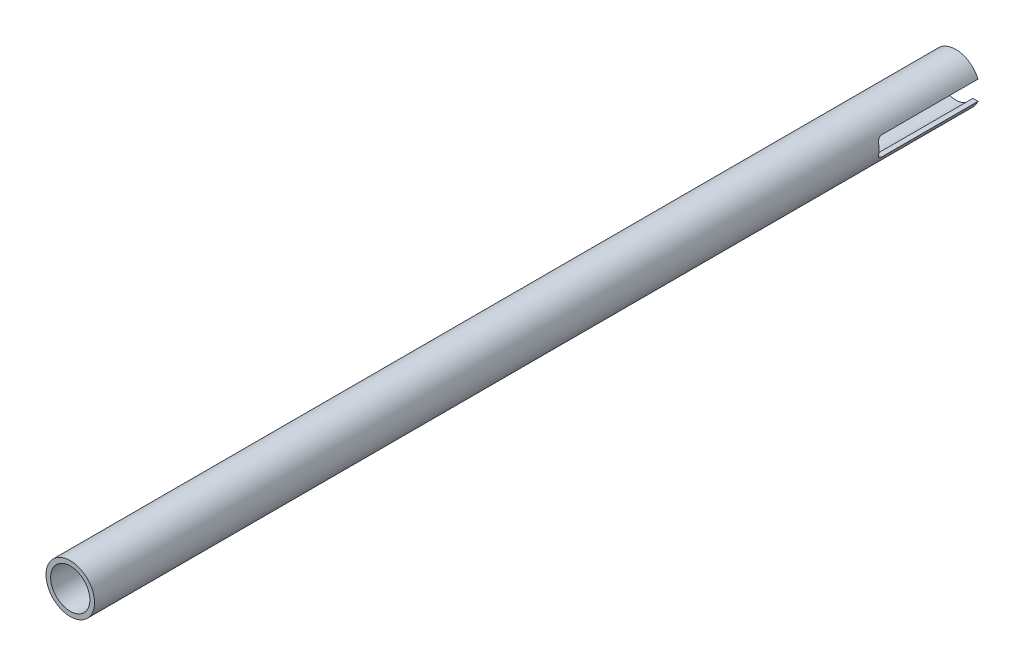
ISO-10303-21;
HEADER;
FILE_DESCRIPTION(('STEP AP214'),'2;1');
FILE_NAME('part.step','',(''),(''),'','','');
FILE_SCHEMA(('AUTOMOTIVE_DESIGN { 1 0 10303 214 1 1 1 1 }'));
ENDSEC;
DATA;
#1=APPLICATION_CONTEXT('core data for automotive mechanical design processes');
#2=APPLICATION_PROTOCOL_DEFINITION('international standard','automotive_design',2000,#1);
#3=PRODUCT_CONTEXT('',#1,'mechanical');
#4=PRODUCT('Part','Part','',(#3));
#5=PRODUCT_RELATED_PRODUCT_CATEGORY('part','',(#4));
#6=PRODUCT_DEFINITION_FORMATION('','',#4);
#7=PRODUCT_DEFINITION_CONTEXT('part definition',#1,'design');
#8=PRODUCT_DEFINITION('design','',#6,#7);
#9=PRODUCT_DEFINITION_SHAPE('','',#8);
#10=(LENGTH_UNIT() NAMED_UNIT(*) SI_UNIT(.MILLI.,.METRE.));
#11=(NAMED_UNIT(*) PLANE_ANGLE_UNIT() SI_UNIT($,.RADIAN.));
#12=(NAMED_UNIT(*) SI_UNIT($,.STERADIAN.) SOLID_ANGLE_UNIT());
#13=UNCERTAINTY_MEASURE_WITH_UNIT(LENGTH_MEASURE(1.E-05),#10,'distance_accuracy_value','');
#14=(GEOMETRIC_REPRESENTATION_CONTEXT(3) GLOBAL_UNCERTAINTY_ASSIGNED_CONTEXT((#13)) GLOBAL_UNIT_ASSIGNED_CONTEXT((#10,
#11,#12)) REPRESENTATION_CONTEXT('',''));
#15=CARTESIAN_POINT('',(0.,0.,0.));
#16=DIRECTION('',(0.,0.,1.));
#17=DIRECTION('',(1.,0.,0.));
#18=AXIS2_PLACEMENT_3D('',#15,#16,#17);
#19=CARTESIAN_POINT('',(0.,0.,0.));
#20=DIRECTION('',(0.,0.,1.));
#21=DIRECTION('',(1.,0.,0.));
#22=AXIS2_PLACEMENT_3D('',#19,#20,#21);
#23=PLANE('',#22);
#24=DIRECTION('',(-1.,0.,0.));
#25=VECTOR('',#24,1.);
#26=CARTESIAN_POINT('',(376.220399741654,-3.17500000000001,0.));
#27=LINE('',#26,#25);
#28=CARTESIAN_POINT('',(7.34407080575888,-3.17500000000001,0.));
#29=VERTEX_POINT('',#28);
#30=CARTESIAN_POINT('',(5.64543213580679,-3.17499999999999,0.));
#31=VERTEX_POINT('',#30);
#32=EDGE_CURVE('E70',#29,#31,#27,.T.);
#33=ORIENTED_EDGE('',*,*,#32,.F.);
#34=CARTESIAN_POINT('',(0.,0.,0.));
#35=DIRECTION('',(0.,0.,1.));
#36=DIRECTION('',(1.,0.,0.));
#37=AXIS2_PLACEMENT_3D('',#34,#35,#36);
#38=CIRCLE('',#37,8.001);
#39=CARTESIAN_POINT('',(-7.34407080575888,-3.17500000000001,0.));
#40=VERTEX_POINT('',#39);
#41=EDGE_CURVE('E161',#40,#29,#38,.T.);
#42=ORIENTED_EDGE('',*,*,#41,.F.);
#43=CARTESIAN_POINT('',(-5.64543213580682,-3.17500000000001,0.));
#44=VERTEX_POINT('',#43);
#45=EDGE_CURVE('E155',#44,#40,#27,.T.);
#46=ORIENTED_EDGE('',*,*,#45,.F.);
#47=CARTESIAN_POINT('',(0.,0.,0.));
#48=DIRECTION('',(0.,0.,1.));
#49=DIRECTION('',(1.,0.,0.));
#50=AXIS2_PLACEMENT_3D('',#47,#48,#49);
#51=CIRCLE('',#50,6.477);
#52=EDGE_CURVE('E266',#44,#31,#51,.T.);
#53=ORIENTED_EDGE('',*,*,#52,.T.);
#54=EDGE_LOOP('',(#33,#42,#46,#53));
#55=FACE_BOUND('',#54,.T.);
#56=ADVANCED_FACE('F45',(#55),#23,.F.);
#57=CARTESIAN_POINT('',(0.,0.,292.1));
#58=DIRECTION('',(0.,0.,-1.));
#59=DIRECTION('',(-1.,0.,0.));
#60=AXIS2_PLACEMENT_3D('',#57,#58,#59);
#61=CYLINDRICAL_SURFACE('',#60,8.001);
#62=CARTESIAN_POINT('',(0.,0.,292.1));
#63=DIRECTION('',(0.,0.,1.));
#64=DIRECTION('',(1.,0.,0.));
#65=AXIS2_PLACEMENT_3D('',#62,#63,#64);
#66=CIRCLE('',#65,8.001);
#67=CARTESIAN_POINT('',(8.001,0.,292.1));
#68=VERTEX_POINT('',#67);
#69=EDGE_CURVE('E275',#68,#68,#66,.T.);
#70=ORIENTED_EDGE('',*,*,#69,.F.);
#71=EDGE_LOOP('',(#70));
#72=FACE_BOUND('',#71,.T.);
#73=DIRECTION('',(0.,0.,-1.));
#74=VECTOR('',#73,1.);
#75=CARTESIAN_POINT('',(7.34407080575892,3.17499999999991,292.1));
#76=LINE('',#75,#74);
#77=CARTESIAN_POINT('',(7.34407080575894,3.175,0.));
#78=VERTEX_POINT('',#77);
#79=CARTESIAN_POINT('',(7.34407080575889,3.17499999999999,31.75));
#80=VERTEX_POINT('',#79);
#81=EDGE_CURVE('E260',#78,#80,#76,.F.);
#82=ORIENTED_EDGE('',*,*,#81,.F.);
#83=CARTESIAN_POINT('',(-7.34407080575894,3.175,0.));
#84=VERTEX_POINT('',#83);
#85=EDGE_CURVE('E280',#78,#84,#38,.T.);
#86=ORIENTED_EDGE('',*,*,#85,.T.);
#87=DIRECTION('',(0.,0.,-1.));
#88=VECTOR('',#87,1.);
#89=CARTESIAN_POINT('',(-7.34407080575892,3.17499999999991,292.1));
#90=LINE('',#89,#88);
#91=CARTESIAN_POINT('',(-7.34407080575889,3.17499999999999,31.75));
#92=VERTEX_POINT('',#91);
#93=EDGE_CURVE('E263',#92,#84,#90,.T.);
#94=ORIENTED_EDGE('',*,*,#93,.F.);
#95=CARTESIAN_POINT('',(-7.8288057837706,1.65099999999999,33.274));
#96=CARTESIAN_POINT('',(-7.81947795268345,1.69524181564514,33.2739996807889));
#97=CARTESIAN_POINT('',(-7.80977555287386,1.73937906238703,33.2720725755956));
#98=CARTESIAN_POINT('',(-7.7897053190962,1.82715995012294,33.2644259194222));
#99=CARTESIAN_POINT('',(-7.77933765259943,1.870803712116,33.2587073195399));
#100=CARTESIAN_POINT('',(-7.74740781787862,2.00038689143379,33.2359920832168));
#101=CARTESIAN_POINT('',(-7.72497172734663,2.08520038066885,33.2134353611242));
#102=CARTESIAN_POINT('',(-7.67879255624773,2.24931803273243,33.1543529357356));
#103=CARTESIAN_POINT('',(-7.65505009243317,2.32862475603218,33.117833776622));
#104=CARTESIAN_POINT('',(-7.60739952527334,2.47987144136614,33.0318403935313));
#105=CARTESIAN_POINT('',(-7.58349136309819,2.55180862700726,32.9823613118312));
#106=CARTESIAN_POINT('',(-7.53640113822511,2.68773877112478,32.8705553900397));
#107=CARTESIAN_POINT('',(-7.51324222932276,2.75155008701076,32.8079974672164));
#108=CARTESIAN_POINT('',(-7.46969556535498,2.86766507697724,32.6721080561482));
#109=CARTESIAN_POINT('',(-7.44930787514765,2.91996848174228,32.5987763158346));
#110=CARTESIAN_POINT('',(-7.41339882631975,3.00995182097469,32.445356056821));
#111=CARTESIAN_POINT('',(-7.39775949227146,3.04799299625043,32.365507568052));
#112=CARTESIAN_POINT('',(-7.37198636942666,3.10981595853761,32.1996963126839));
#113=CARTESIAN_POINT('',(-7.36184321814924,3.13362200161646,32.1137442276388));
#114=CARTESIAN_POINT('',(-7.35134082404798,3.15814271182933,31.980748149592));
#115=CARTESIAN_POINT('',(-7.34862226710174,3.16445643648463,31.9348527548858));
#116=CARTESIAN_POINT('',(-7.34498545577234,3.17288497032065,31.8426477775769));
#117=CARTESIAN_POINT('',(-7.34406565426136,3.17500338794749,31.7963385853611));
#118=CARTESIAN_POINT('',(-7.34407080575889,3.17499999999999,31.75));
#119=B_SPLINE_CURVE_WITH_KNOTS('',3,(#95,#96,#97,#98,#99,#100,#101,#102,#103,#104,#105,#106,
#107,#108,#109,#110,#111,#112,#113,#114,#115,#116,#117,#118),.UNSPECIFIED.,.F.,.F.,(4,2,2,2,2,2,
2,2,2,2,2,4),(0.,0.135553024626245,0.271072058592375,0.541437670457962,0.811676717226676,
1.08201720207601,1.35761362878683,1.63321650449497,1.90127196271359,2.16886935439238,
2.3078905012207,2.44679202186551),.UNSPECIFIED.);
#120=CARTESIAN_POINT('',(-7.8288057837706,1.65099999999999,33.274));
#121=VERTEX_POINT('',#120);
#122=EDGE_CURVE('E246',#121,#92,#119,.T.);
#123=ORIENTED_EDGE('',*,*,#122,.F.);
#124=CARTESIAN_POINT('',(0.,0.,33.274));
#125=DIRECTION('',(0.,0.,-1.));
#126=DIRECTION('',(-1.,0.,0.));
#127=AXIS2_PLACEMENT_3D('',#124,#125,#126);
#128=CIRCLE('',#127,8.001);
#129=CARTESIAN_POINT('',(-7.8288057837706,-1.65100000000001,33.274));
#130=VERTEX_POINT('',#129);
#131=EDGE_CURVE('E148',#130,#121,#128,.T.);
#132=ORIENTED_EDGE('',*,*,#131,.F.);
#133=CARTESIAN_POINT('',(-7.34407080575888,-3.175,31.75));
#134=CARTESIAN_POINT('',(-7.3440680096913,-3.17500157818638,31.7906984476088));
#135=CARTESIAN_POINT('',(-7.34477630214677,-3.17336860893187,31.8313759502433));
#136=CARTESIAN_POINT('',(-7.34758309143993,-3.16686635956913,31.912411407968));
#137=CARTESIAN_POINT('',(-7.34968118035477,-3.16199802907896,31.9527694533067));
#138=CARTESIAN_POINT('',(-7.35798857580184,-3.14264423927033,32.0726338560667));
#139=CARTESIAN_POINT('',(-7.36621159330718,-3.12340930879257,32.1512906881812));
#140=CARTESIAN_POINT('',(-7.38735918413182,-3.07305366060584,32.3038993996992));
#141=CARTESIAN_POINT('',(-7.40028060607282,-3.04194090905529,32.377854393813));
#142=CARTESIAN_POINT('',(-7.4298815779994,-2.96890708335138,32.5194453435949));
#143=CARTESIAN_POINT('',(-7.44656372650464,-2.92697853298673,32.5870768840646));
#144=CARTESIAN_POINT('',(-7.48338951433548,-2.83153727514408,32.7173193992745));
#145=CARTESIAN_POINT('',(-7.5036517696014,-2.77760154335605,32.7795861247467));
#146=CARTESIAN_POINT('',(-7.54586923311684,-2.66077336101833,32.8943978381578));
#147=CARTESIAN_POINT('',(-7.56782510086072,-2.59787741319581,32.9469390116058));
#148=CARTESIAN_POINT('',(-7.61377353576087,-2.46009532987571,33.04442490565));
#149=CARTESIAN_POINT('',(-7.63780327629239,-2.38468542927396,33.088613263246));
#150=CARTESIAN_POINT('',(-7.68517828309943,-2.22728162943213,33.1635295949975));
#151=CARTESIAN_POINT('',(-7.70852388215322,-2.14529100625114,33.1942642181981));
#152=CARTESIAN_POINT('',(-7.74866065435345,-1.99473307846589,33.2363269168587));
#153=CARTESIAN_POINT('',(-7.76579152458538,-1.9270088220366,33.2503889784846));
#154=CARTESIAN_POINT('',(-7.79853598216448,-1.78994063052703,33.2692336722557));
#155=CARTESIAN_POINT('',(-7.81414985826825,-1.7205970068191,33.2740180736839));
#156=CARTESIAN_POINT('',(-7.8288057837706,-1.65100000000001,33.274));
#157=B_SPLINE_CURVE_WITH_KNOTS('',3,(#133,#134,#135,#136,#137,#138,#139,#140,#141,#142,#143,
#144,#145,#146,#147,#148,#149,#150,#151,#152,#153,#154,#155,#156),.UNSPECIFIED.,.F.,.F.,(4,2,2,
2,2,2,2,2,2,2,2,4),(0.,0.122015614312961,0.243995431359561,0.486888996424005,0.729619944201783,
0.972519126749106,1.22593711832599,1.47945429417213,1.75015649231413,2.02072475374974,
2.23388433321154,2.44700325838136),.UNSPECIFIED.);
#158=CARTESIAN_POINT('',(-7.34407080575888,-3.175,31.75));
#159=VERTEX_POINT('',#158);
#160=EDGE_CURVE('E149',#159,#130,#157,.T.);
#161=ORIENTED_EDGE('',*,*,#160,.F.);
#162=DIRECTION('',(0.,0.,-1.));
#163=VECTOR('',#162,1.);
#164=CARTESIAN_POINT('',(-7.34407080575889,-3.17499999999999,292.1));
#165=LINE('',#164,#163);
#166=EDGE_CURVE('E163',#40,#159,#165,.F.);
#167=ORIENTED_EDGE('',*,*,#166,.F.);
#168=ORIENTED_EDGE('',*,*,#41,.T.);
#169=DIRECTION('',(0.,0.,-1.));
#170=VECTOR('',#169,1.);
#171=CARTESIAN_POINT('',(7.34407080575889,-3.17499999999999,292.1));
#172=LINE('',#171,#170);
#173=CARTESIAN_POINT('',(7.34407080575888,-3.175,31.75));
#174=VERTEX_POINT('',#173);
#175=EDGE_CURVE('E152',#174,#29,#172,.T.);
#176=ORIENTED_EDGE('',*,*,#175,.F.);
#177=CARTESIAN_POINT('',(7.8288057837706,-1.65100000000001,33.274));
#178=CARTESIAN_POINT('',(7.81947795268344,-1.69524181564516,33.2739996807889));
#179=CARTESIAN_POINT('',(7.80977555287386,-1.73937906238705,33.2720725755956));
#180=CARTESIAN_POINT('',(7.78970531909619,-1.82715995012295,33.2644259194222));
#181=CARTESIAN_POINT('',(7.77933765259943,-1.87080371211602,33.2587073195399));
#182=CARTESIAN_POINT('',(7.74740781787862,-2.00038689143381,33.2359920832168));
#183=CARTESIAN_POINT('',(7.72497172734662,-2.08520038066886,33.2134353611242));
#184=CARTESIAN_POINT('',(7.67879255624773,-2.24931803273245,33.1543529357356));
#185=CARTESIAN_POINT('',(7.65505009243317,-2.3286247560322,33.117833776622));
#186=CARTESIAN_POINT('',(7.60739952527334,-2.47987144136616,33.0318403935313));
#187=CARTESIAN_POINT('',(7.58349136309819,-2.55180862700728,32.9823613118312));
#188=CARTESIAN_POINT('',(7.5364011382251,-2.6877387711248,32.8705553900397));
#189=CARTESIAN_POINT('',(7.51324222932275,-2.75155008701078,32.8079974672164));
#190=CARTESIAN_POINT('',(7.46969556535497,-2.86766507697726,32.6721080561482));
#191=CARTESIAN_POINT('',(7.44930787514765,-2.9199684817423,32.5987763158346));
#192=CARTESIAN_POINT('',(7.41339882631974,-3.00995182097471,32.445356056821));
#193=CARTESIAN_POINT('',(7.39775949227145,-3.04799299625045,32.365507568052));
#194=CARTESIAN_POINT('',(7.37198636942665,-3.10981595853762,32.1996963126839));
#195=CARTESIAN_POINT('',(7.36184321814923,-3.13362200161647,32.1137442276388));
#196=CARTESIAN_POINT('',(7.35134082404797,-3.15814271182935,31.980748149592));
#197=CARTESIAN_POINT('',(7.34862226710173,-3.16445643648464,31.9348527548858));
#198=CARTESIAN_POINT('',(7.34498545577233,-3.17288497032067,31.8426477775769));
#199=CARTESIAN_POINT('',(7.34406565426135,-3.17500338794751,31.7963385853611));
#200=CARTESIAN_POINT('',(7.34407080575888,-3.175,31.75));
#201=B_SPLINE_CURVE_WITH_KNOTS('',3,(#177,#178,#179,#180,#181,#182,#183,#184,#185,#186,#187,
#188,#189,#190,#191,#192,#193,#194,#195,#196,#197,#198,#199,#200),.UNSPECIFIED.,.F.,.F.,(4,2,2,
2,2,2,2,2,2,2,2,4),(0.,0.135553024626244,0.271072058592371,0.541437670457961,0.811676717226673,
1.082017202076,1.35761362878683,1.63321650449497,1.90127196271358,2.16886935439238,
2.3078905012207,2.4467920218655),.UNSPECIFIED.);
#202=CARTESIAN_POINT('',(7.8288057837706,-1.65100000000001,33.274));
#203=VERTEX_POINT('',#202);
#204=EDGE_CURVE('E137',#203,#174,#201,.T.);
#205=ORIENTED_EDGE('',*,*,#204,.F.);
#206=CARTESIAN_POINT('',(7.8288057837706,1.65099999999999,33.274));
#207=VERTEX_POINT('',#206);
#208=EDGE_CURVE('E253',#207,#203,#128,.T.);
#209=ORIENTED_EDGE('',*,*,#208,.F.);
#210=CARTESIAN_POINT('',(7.34407080575889,3.17499999999999,31.75));
#211=CARTESIAN_POINT('',(7.34406800969131,3.17500157818637,31.7906984476088));
#212=CARTESIAN_POINT('',(7.34477630214678,3.17336860893185,31.8313759502433));
#213=CARTESIAN_POINT('',(7.34758309143993,3.16686635956911,31.912411407968));
#214=CARTESIAN_POINT('',(7.34968118035478,3.16199802907894,31.9527694533067));
#215=CARTESIAN_POINT('',(7.35798857580184,3.14264423927031,32.0726338560667));
#216=CARTESIAN_POINT('',(7.36621159330719,3.12340930879255,32.1512906881812));
#217=CARTESIAN_POINT('',(7.38735918413183,3.07305366060582,32.3038993996992));
#218=CARTESIAN_POINT('',(7.40028060607282,3.04194090905527,32.377854393813));
#219=CARTESIAN_POINT('',(7.42988157799941,2.96890708335136,32.5194453435949));
#220=CARTESIAN_POINT('',(7.44656372650465,2.92697853298671,32.5870768840646));
#221=CARTESIAN_POINT('',(7.48338951433549,2.83153727514406,32.7173193992745));
#222=CARTESIAN_POINT('',(7.50365176960141,2.77760154335604,32.7795861247467));
#223=CARTESIAN_POINT('',(7.54586923311685,2.66077336101832,32.8943978381578));
#224=CARTESIAN_POINT('',(7.56782510086072,2.59787741319579,32.9469390116058));
#225=CARTESIAN_POINT('',(7.61377353576087,2.4600953298757,33.04442490565));
#226=CARTESIAN_POINT('',(7.6378032762924,2.38468542927394,33.088613263246));
#227=CARTESIAN_POINT('',(7.68517828309944,2.22728162943211,33.1635295949975));
#228=CARTESIAN_POINT('',(7.70852388215323,2.14529100625112,33.1942642181981));
#229=CARTESIAN_POINT('',(7.74866065435345,1.99473307846586,33.2363269168587));
#230=CARTESIAN_POINT('',(7.76579152458538,1.92700882203658,33.2503889784846));
#231=CARTESIAN_POINT('',(7.79853598216448,1.78994063052701,33.2692336722557));
#232=CARTESIAN_POINT('',(7.81414985826825,1.72059700681908,33.2740180736839));
#233=CARTESIAN_POINT('',(7.8288057837706,1.65099999999999,33.274));
#234=B_SPLINE_CURVE_WITH_KNOTS('',3,(#210,#211,#212,#213,#214,#215,#216,#217,#218,#219,#220,
#221,#222,#223,#224,#225,#226,#227,#228,#229,#230,#231,#232,#233),.UNSPECIFIED.,.F.,.F.,(4,2,2,
2,2,2,2,2,2,2,2,4),(0.,0.122015614312961,0.243995431359561,0.486888996424005,0.729619944201783,
0.972519126749114,1.22593711832599,1.47945429417213,1.75015649231414,2.02072475374975,
2.23388433321155,2.44700325838137),.UNSPECIFIED.);
#235=EDGE_CURVE('E252',#80,#207,#234,.T.);
#236=ORIENTED_EDGE('',*,*,#235,.F.);
#237=EDGE_LOOP('',(#82,#86,#94,#123,#132,#161,#167,#168,#176,#205,#209,#236));
#238=FACE_BOUND('',#237,.T.);
#239=ADVANCED_FACE('F47',(#72,#238),#61,.T.);
#240=CARTESIAN_POINT('',(0.,0.,292.1));
#241=DIRECTION('',(0.,0.,-1.));
#242=DIRECTION('',(-1.,0.,0.));
#243=AXIS2_PLACEMENT_3D('',#240,#241,#242);
#244=CYLINDRICAL_SURFACE('',#243,6.477);
#245=CARTESIAN_POINT('',(0.,0.,292.1));
#246=DIRECTION('',(0.,0.,1.));
#247=DIRECTION('',(1.,0.,0.));
#248=AXIS2_PLACEMENT_3D('',#245,#246,#247);
#249=CIRCLE('',#248,6.477);
#250=CARTESIAN_POINT('',(6.477,0.,292.1));
#251=VERTEX_POINT('',#250);
#252=EDGE_CURVE('E267',#251,#251,#249,.T.);
#253=ORIENTED_EDGE('',*,*,#252,.T.);
#254=EDGE_LOOP('',(#253));
#255=FACE_BOUND('',#254,.T.);
#256=CARTESIAN_POINT('',(5.64543213580682,3.175,0.));
#257=VERTEX_POINT('',#256);
#258=CARTESIAN_POINT('',(-5.64543213580682,3.175,0.));
#259=VERTEX_POINT('',#258);
#260=EDGE_CURVE('E271',#257,#259,#51,.T.);
#261=ORIENTED_EDGE('',*,*,#260,.F.);
#262=DIRECTION('',(0.,0.,-1.));
#263=VECTOR('',#262,1.);
#264=CARTESIAN_POINT('',(5.64543213580684,3.17499999999991,292.1));
#265=LINE('',#264,#263);
#266=CARTESIAN_POINT('',(5.64543213580679,3.17499999999999,31.75));
#267=VERTEX_POINT('',#266);
#268=EDGE_CURVE('E11',#257,#267,#265,.F.);
#269=ORIENTED_EDGE('',*,*,#268,.T.);
#270=CARTESIAN_POINT('',(5.6454321358068,3.17499999999999,31.75));
#271=CARTESIAN_POINT('',(5.64542798532432,3.1750025301249,31.7895022750384));
#272=CARTESIAN_POINT('',(5.64629676751123,3.17346305780188,31.8289831851797));
#273=CARTESIAN_POINT('',(5.64973489172762,3.16734010596933,31.907616333837));
#274=CARTESIAN_POINT('',(5.65230347216193,3.16275798971433,31.9467687115998));
#275=CARTESIAN_POINT('',(5.66245282356231,3.14457608288718,32.0629070155873));
#276=CARTESIAN_POINT('',(5.67247830845162,3.1265396508718,32.1390381879893));
#277=CARTESIAN_POINT('',(5.69814957474155,3.07950075965754,32.2866255007952));
#278=CARTESIAN_POINT('',(5.71378770060105,3.05051323473277,32.3580878532046));
#279=CARTESIAN_POINT('',(5.74949312759986,2.98267072120713,32.4950337996201));
#280=CARTESIAN_POINT('',(5.7695654342793,2.94380457356395,32.5605105176722));
#281=CARTESIAN_POINT('',(5.81427344287328,2.85454020484128,32.6883725064171));
#282=CARTESIAN_POINT('',(5.83912294015509,2.80355001313473,32.7502682413202));
#283=CARTESIAN_POINT('',(5.89090094280743,2.69305400468479,32.8649190340714));
#284=CARTESIAN_POINT('',(5.91783040535228,2.63354425646504,32.9176698468731));
#285=CARTESIAN_POINT('',(5.9754026920417,2.50037980782341,33.0183991647787));
#286=CARTESIAN_POINT('',(6.00613015030678,2.42589024924425,33.0652294493506));
#287=CARTESIAN_POINT('',(6.06685054178971,2.26977298542591,33.1454912659983));
#288=CARTESIAN_POINT('',(6.09684379767184,2.18814849062352,33.1789287868608));
#289=CARTESIAN_POINT('',(6.15068954263711,2.0313545212819,33.2277262918858));
#290=CARTESIAN_POINT('',(6.17481721444706,1.95685658409067,33.2449485076857));
#291=CARTESIAN_POINT('',(6.2208090046563,1.80539896583251,33.2681012531514));
#292=CARTESIAN_POINT('',(6.24267154884635,1.72843762073706,33.2740239790673));
#293=CARTESIAN_POINT('',(6.26304462701648,1.65099999999999,33.274));
#294=B_SPLINE_CURVE_WITH_KNOTS('',3,(#270,#271,#272,#273,#274,#275,#276,#277,#278,#279,#280,
#281,#282,#283,#284,#285,#286,#287,#288,#289,#290,#291,#292,#293),.UNSPECIFIED.,.F.,.F.,(4,2,2,
2,2,2,2,2,2,2,2,4),(0.,0.118426117882553,0.236799210795268,0.472172634307253,0.707226225252078,
0.942546525606806,1.19340365391803,1.44437691938388,1.72272641785956,2.0009513086068,
2.2406452178067,2.48050460661625),.UNSPECIFIED.);
#295=CARTESIAN_POINT('',(6.26304462701648,1.65099999999999,33.274));
#296=VERTEX_POINT('',#295);
#297=EDGE_CURVE('E55',#267,#296,#294,.T.);
#298=ORIENTED_EDGE('',*,*,#297,.T.);
#299=CARTESIAN_POINT('',(0.,0.,33.274));
#300=DIRECTION('',(0.,0.,-1.));
#301=DIRECTION('',(-1.,0.,0.));
#302=AXIS2_PLACEMENT_3D('',#299,#300,#301);
#303=CIRCLE('',#302,6.477);
#304=CARTESIAN_POINT('',(6.26304462701648,-1.65100000000001,33.274));
#305=VERTEX_POINT('',#304);
#306=EDGE_CURVE('E208',#296,#305,#303,.T.);
#307=ORIENTED_EDGE('',*,*,#306,.T.);
#308=CARTESIAN_POINT('',(6.26304462701648,-1.65100000000001,33.274));
#309=CARTESIAN_POINT('',(6.25119301356599,-1.69597019045452,33.2739996512926));
#310=CARTESIAN_POINT('',(6.23885805015263,-1.74078424361484,33.2720087653986));
#311=CARTESIAN_POINT('',(6.21333080831812,-1.82980515275706,33.264134138941));
#312=CARTESIAN_POINT('',(6.20013884930389,-1.87401222760585,33.2582518413062));
#313=CARTESIAN_POINT('',(6.15951133396886,-2.00506101361784,33.2349457970163));
#314=CARTESIAN_POINT('',(6.13094979172369,-2.09061085165535,33.2118617467996));
#315=CARTESIAN_POINT('',(6.07212151471613,-2.25578612168244,33.1516219603263));
#316=CARTESIAN_POINT('',(6.04185654214358,-2.33541748531392,33.1144805465843));
#317=CARTESIAN_POINT('',(5.98100165398782,-2.48713337520254,33.0271532445204));
#318=CARTESIAN_POINT('',(5.95041151302896,-2.55921223237762,32.9769576544588));
#319=CARTESIAN_POINT('',(5.88959770370069,-2.69629003214929,32.8627307014112));
#320=CARTESIAN_POINT('',(5.85942026108732,-2.76097278644595,32.7982938275107));
#321=CARTESIAN_POINT('',(5.80262181829034,-2.87843237174363,32.6579375307773));
#322=CARTESIAN_POINT('',(5.77600068690932,-2.93120964200445,32.5820185317567));
#323=CARTESIAN_POINT('',(5.72961508062245,-3.02084256755071,32.4238173863488));
#324=CARTESIAN_POINT('',(5.70961192114585,-3.05826802843451,32.3419300118511));
#325=CARTESIAN_POINT('',(5.67705818777086,-3.11828924116529,32.1715909438744));
#326=CARTESIAN_POINT('',(5.66448853762436,-3.14092296814996,32.0831567140417));
#327=CARTESIAN_POINT('',(5.65274801817815,-3.16196375608022,31.953042864781));
#328=CARTESIAN_POINT('',(5.65001234622036,-3.16684526064363,31.9126313476031));
#329=CARTESIAN_POINT('',(5.64635324825543,-3.17336296637714,31.8314890576694));
#330=CARTESIAN_POINT('',(5.64542881846813,-3.17500096508517,31.790758474312));
#331=CARTESIAN_POINT('',(5.64543213580679,-3.175,31.75));
#332=B_SPLINE_CURVE_WITH_KNOTS('',3,(#308,#309,#310,#311,#312,#313,#314,#315,#316,#317,#318,
#319,#320,#321,#322,#323,#324,#325,#326,#327,#328,#329,#330,#331),.UNSPECIFIED.,.F.,.F.,(4,2,2,
2,2,2,2,2,2,2,2,4),(0.,0.139419976741779,0.278788285754547,0.556665652257203,0.834260658887697,
1.11206256399923,1.3991269523371,1.6861807475333,1.9613229485987,2.23575596690122,
2.35800176569004,2.48017979736539),.UNSPECIFIED.);
#333=CARTESIAN_POINT('',(5.64543213580682,-3.175,31.75));
#334=VERTEX_POINT('',#333);
#335=EDGE_CURVE('E201',#305,#334,#332,.T.);
#336=ORIENTED_EDGE('',*,*,#335,.T.);
#337=DIRECTION('',(0.,0.,-1.));
#338=VECTOR('',#337,1.);
#339=CARTESIAN_POINT('',(5.64543213580679,-3.17499999999999,292.1));
#340=LINE('',#339,#338);
#341=EDGE_CURVE('E153',#334,#31,#340,.T.);
#342=ORIENTED_EDGE('',*,*,#341,.T.);
#343=ORIENTED_EDGE('',*,*,#52,.F.);
#344=DIRECTION('',(0.,0.,-1.));
#345=VECTOR('',#344,1.);
#346=CARTESIAN_POINT('',(-5.64543213580679,-3.17499999999999,292.1));
#347=LINE('',#346,#345);
#348=CARTESIAN_POINT('',(-5.64543213580679,-3.17499999999999,31.7500000000001));
#349=VERTEX_POINT('',#348);
#350=EDGE_CURVE('E279',#44,#349,#347,.F.);
#351=ORIENTED_EDGE('',*,*,#350,.T.);
#352=CARTESIAN_POINT('',(-5.64543213580679,-3.175,31.75));
#353=CARTESIAN_POINT('',(-5.64542798532432,-3.17500253012492,31.7895022750384));
#354=CARTESIAN_POINT('',(-5.64629676751122,-3.17346305780189,31.8289831851797));
#355=CARTESIAN_POINT('',(-5.64973489172761,-3.16734010596935,31.907616333837));
#356=CARTESIAN_POINT('',(-5.65230347216192,-3.16275798971435,31.9467687115998));
#357=CARTESIAN_POINT('',(-5.6624528235623,-3.1445760828872,32.0629070155873));
#358=CARTESIAN_POINT('',(-5.67247830845161,-3.12653965087182,32.1390381879893));
#359=CARTESIAN_POINT('',(-5.69814957474154,-3.07950075965756,32.2866255007952));
#360=CARTESIAN_POINT('',(-5.71378770060104,-3.05051323473279,32.3580878532046));
#361=CARTESIAN_POINT('',(-5.74949312759985,-2.98267072120715,32.4950337996201));
#362=CARTESIAN_POINT('',(-5.76956543427929,-2.94380457356397,32.5605105176722));
#363=CARTESIAN_POINT('',(-5.81427344287327,-2.85454020484131,32.6883725064171));
#364=CARTESIAN_POINT('',(-5.83912294015508,-2.80355001313475,32.7502682413202));
#365=CARTESIAN_POINT('',(-5.89090094280742,-2.69305400468481,32.8649190340714));
#366=CARTESIAN_POINT('',(-5.91783040535227,-2.63354425646506,32.9176698468731));
#367=CARTESIAN_POINT('',(-5.97540269204169,-2.50037980782343,33.0183991647787));
#368=CARTESIAN_POINT('',(-6.00613015030677,-2.42589024924428,33.0652294493506));
#369=CARTESIAN_POINT('',(-6.0668505417897,-2.26977298542594,33.1454912659983));
#370=CARTESIAN_POINT('',(-6.09684379767183,-2.18814849062355,33.1789287868608));
#371=CARTESIAN_POINT('',(-6.1506895426371,-2.03135452128193,33.2277262918858));
#372=CARTESIAN_POINT('',(-6.17481721444705,-1.9568565840907,33.2449485076857));
#373=CARTESIAN_POINT('',(-6.22080900465629,-1.80539896583254,33.2681012531514));
#374=CARTESIAN_POINT('',(-6.24267154884634,-1.72843762073708,33.2740239790673));
#375=CARTESIAN_POINT('',(-6.26304462701648,-1.65100000000001,33.274));
#376=B_SPLINE_CURVE_WITH_KNOTS('',3,(#352,#353,#354,#355,#356,#357,#358,#359,#360,#361,#362,
#363,#364,#365,#366,#367,#368,#369,#370,#371,#372,#373,#374,#375),.UNSPECIFIED.,.F.,.F.,(4,2,2,
2,2,2,2,2,2,2,2,4),(0.,0.118426117882546,0.236799210795261,0.472172634307245,0.707226225252078,
0.942546525606797,1.19340365391802,1.44437691938387,1.72272641785954,2.00095130860679,
2.24064521780669,2.48050460661625),.UNSPECIFIED.);
#377=CARTESIAN_POINT('',(-6.26304462701648,-1.65100000000001,33.274));
#378=VERTEX_POINT('',#377);
#379=EDGE_CURVE('E191',#349,#378,#376,.T.);
#380=ORIENTED_EDGE('',*,*,#379,.T.);
#381=CARTESIAN_POINT('',(-6.26304462701648,1.65099999999999,33.274));
#382=VERTEX_POINT('',#381);
#383=EDGE_CURVE('E234',#378,#382,#303,.T.);
#384=ORIENTED_EDGE('',*,*,#383,.T.);
#385=CARTESIAN_POINT('',(-6.26304462701648,1.65099999999999,33.274));
#386=CARTESIAN_POINT('',(-6.25119301356599,1.6959701904545,33.2739996512926));
#387=CARTESIAN_POINT('',(-6.23885805015264,1.74078424361482,33.2720087653986));
#388=CARTESIAN_POINT('',(-6.21333080831813,1.82980515275704,33.264134138941));
#389=CARTESIAN_POINT('',(-6.20013884930389,1.87401222760583,33.2582518413062));
#390=CARTESIAN_POINT('',(-6.15951133396887,2.00506101361782,33.2349457970163));
#391=CARTESIAN_POINT('',(-6.1309497917237,2.09061085165533,33.2118617467996));
#392=CARTESIAN_POINT('',(-6.07212151471614,2.25578612168242,33.1516219603263));
#393=CARTESIAN_POINT('',(-6.04185654214358,2.3354174853139,33.1144805465843));
#394=CARTESIAN_POINT('',(-5.98100165398783,2.48713337520252,33.0271532445204));
#395=CARTESIAN_POINT('',(-5.95041151302897,2.5592122323776,32.9769576544588));
#396=CARTESIAN_POINT('',(-5.8895977037007,2.69629003214927,32.8627307014112));
#397=CARTESIAN_POINT('',(-5.85942026108733,2.76097278644594,32.7982938275107));
#398=CARTESIAN_POINT('',(-5.80262181829035,2.87843237174361,32.6579375307773));
#399=CARTESIAN_POINT('',(-5.77600068690933,2.93120964200443,32.5820185317567));
#400=CARTESIAN_POINT('',(-5.72961508062246,3.02084256755069,32.4238173863488));
#401=CARTESIAN_POINT('',(-5.70961192114586,3.0582680284345,32.3419300118511));
#402=CARTESIAN_POINT('',(-5.67705818777087,3.11828924116527,32.1715909438744));
#403=CARTESIAN_POINT('',(-5.66448853762437,3.14092296814994,32.0831567140417));
#404=CARTESIAN_POINT('',(-5.65274801817816,3.1619637560802,31.953042864781));
#405=CARTESIAN_POINT('',(-5.65001234622037,3.16684526064361,31.9126313476031));
#406=CARTESIAN_POINT('',(-5.64635324825544,3.17336296637712,31.8314890576694));
#407=CARTESIAN_POINT('',(-5.64542881846814,3.17500096508515,31.790758474312));
#408=CARTESIAN_POINT('',(-5.6454321358068,3.17499999999999,31.75));
#409=B_SPLINE_CURVE_WITH_KNOTS('',3,(#385,#386,#387,#388,#389,#390,#391,#392,#393,#394,#395,
#396,#397,#398,#399,#400,#401,#402,#403,#404,#405,#406,#407,#408),.UNSPECIFIED.,.F.,.F.,(4,2,2,
2,2,2,2,2,2,2,2,4),(0.,0.139419976741779,0.278788285754548,0.556665652257205,0.834260658887702,
1.11206256399923,1.39912695233711,1.68618074753331,1.9613229485987,2.23575596690122,
2.35800176569004,2.4801797973654),.UNSPECIFIED.);
#410=CARTESIAN_POINT('',(-5.64543213580679,3.17499999999999,31.75));
#411=VERTEX_POINT('',#410);
#412=EDGE_CURVE('E226',#382,#411,#409,.T.);
#413=ORIENTED_EDGE('',*,*,#412,.T.);
#414=DIRECTION('',(0.,0.,-1.));
#415=VECTOR('',#414,1.);
#416=CARTESIAN_POINT('',(-5.64543213580684,3.17499999999991,292.1));
#417=LINE('',#416,#415);
#418=EDGE_CURVE('E233',#411,#259,#417,.T.);
#419=ORIENTED_EDGE('',*,*,#418,.T.);
#420=EDGE_LOOP('',(#261,#269,#298,#307,#336,#342,#343,#351,#380,#384,#413,#419));
#421=FACE_BOUND('',#420,.T.);
#422=ADVANCED_FACE('F214',(#255,#421),#244,.F.);
#423=CARTESIAN_POINT('',(0.,0.,292.1));
#424=DIRECTION('',(0.,0.,1.));
#425=DIRECTION('',(1.,0.,0.));
#426=AXIS2_PLACEMENT_3D('',#423,#424,#425);
#427=PLANE('',#426);
#428=ORIENTED_EDGE('',*,*,#69,.T.);
#429=EDGE_LOOP('',(#428));
#430=FACE_BOUND('',#429,.T.);
#431=ORIENTED_EDGE('',*,*,#252,.F.);
#432=EDGE_LOOP('',(#431));
#433=FACE_BOUND('',#432,.T.);
#434=ADVANCED_FACE('F219',(#430,#433),#427,.T.);
#435=ORIENTED_EDGE('',*,*,#85,.F.);
#436=DIRECTION('',(-1.,0.,0.));
#437=VECTOR('',#436,1.);
#438=CARTESIAN_POINT('',(376.220399741654,3.175,0.));
#439=LINE('',#438,#437);
#440=EDGE_CURVE('E168',#78,#257,#439,.T.);
#441=ORIENTED_EDGE('',*,*,#440,.T.);
#442=ORIENTED_EDGE('',*,*,#260,.T.);
#443=EDGE_CURVE('E306',#259,#84,#439,.T.);
#444=ORIENTED_EDGE('',*,*,#443,.T.);
#445=EDGE_LOOP('',(#435,#441,#442,#444));
#446=FACE_BOUND('',#445,.T.);
#447=ADVANCED_FACE('F345',(#446),#23,.F.);
#448=CARTESIAN_POINT('',(376.220399741654,-3.175,31.75));
#449=DIRECTION('',(0.,1.,0.));
#450=DIRECTION('',(0.,0.,1.));
#451=AXIS2_PLACEMENT_3D('',#448,#449,#450);
#452=PLANE('',#451);
#453=ORIENTED_EDGE('',*,*,#45,.T.);
#454=ORIENTED_EDGE('',*,*,#166,.T.);
#455=DIRECTION('',(-1.,0.,0.));
#456=VECTOR('',#455,1.);
#457=CARTESIAN_POINT('',(376.220399741654,-3.175,31.75));
#458=LINE('',#457,#456);
#459=EDGE_CURVE('E62',#349,#159,#458,.T.);
#460=ORIENTED_EDGE('',*,*,#459,.F.);
#461=ORIENTED_EDGE('',*,*,#350,.F.);
#462=EDGE_LOOP('',(#453,#454,#460,#461));
#463=FACE_BOUND('',#462,.T.);
#464=ADVANCED_FACE('F359',(#463),#452,.T.);
#465=CARTESIAN_POINT('',(376.220399741654,-1.65100000000001,31.75));
#466=DIRECTION('',(-1.,0.,0.));
#467=DIRECTION('',(0.,0.,1.));
#468=AXIS2_PLACEMENT_3D('',#465,#466,#467);
#469=CYLINDRICAL_SURFACE('',#468,1.524);
#470=ORIENTED_EDGE('',*,*,#459,.T.);
#471=ORIENTED_EDGE('',*,*,#160,.T.);
#472=DIRECTION('',(-1.,0.,0.));
#473=VECTOR('',#472,1.);
#474=CARTESIAN_POINT('',(376.220399741654,-1.65100000000001,33.274));
#475=LINE('',#474,#473);
#476=EDGE_CURVE('E318',#378,#130,#475,.T.);
#477=ORIENTED_EDGE('',*,*,#476,.F.);
#478=ORIENTED_EDGE('',*,*,#379,.F.);
#479=EDGE_LOOP('',(#470,#471,#477,#478));
#480=FACE_BOUND('',#479,.T.);
#481=ADVANCED_FACE('F186',(#480),#469,.F.);
#482=CARTESIAN_POINT('',(376.220399741654,1.65099999999999,33.274));
#483=DIRECTION('',(0.,0.,-1.));
#484=DIRECTION('',(-1.,0.,0.));
#485=AXIS2_PLACEMENT_3D('',#482,#483,#484);
#486=PLANE('',#485);
#487=ORIENTED_EDGE('',*,*,#476,.T.);
#488=ORIENTED_EDGE('',*,*,#131,.T.);
#489=DIRECTION('',(-1.,0.,0.));
#490=VECTOR('',#489,1.);
#491=CARTESIAN_POINT('',(376.220399741654,1.65099999999999,33.274));
#492=LINE('',#491,#490);
#493=EDGE_CURVE('E314',#382,#121,#492,.T.);
#494=ORIENTED_EDGE('',*,*,#493,.F.);
#495=ORIENTED_EDGE('',*,*,#383,.F.);
#496=EDGE_LOOP('',(#487,#488,#494,#495));
#497=FACE_BOUND('',#496,.T.);
#498=ADVANCED_FACE('F334',(#497),#486,.T.);
#499=CARTESIAN_POINT('',(376.220399741654,1.65099999999999,31.75));
#500=DIRECTION('',(-1.,0.,0.));
#501=DIRECTION('',(0.,0.,1.));
#502=AXIS2_PLACEMENT_3D('',#499,#500,#501);
#503=CYLINDRICAL_SURFACE('',#502,1.524);
#504=ORIENTED_EDGE('',*,*,#493,.T.);
#505=ORIENTED_EDGE('',*,*,#122,.T.);
#506=DIRECTION('',(-1.,0.,0.));
#507=VECTOR('',#506,1.);
#508=CARTESIAN_POINT('',(376.220399741654,3.17499999999999,31.75));
#509=LINE('',#508,#507);
#510=EDGE_CURVE('E307',#411,#92,#509,.T.);
#511=ORIENTED_EDGE('',*,*,#510,.F.);
#512=ORIENTED_EDGE('',*,*,#412,.F.);
#513=EDGE_LOOP('',(#504,#505,#511,#512));
#514=FACE_BOUND('',#513,.T.);
#515=ADVANCED_FACE('F240',(#514),#503,.F.);
#516=CARTESIAN_POINT('',(376.220399741654,3.175,0.));
#517=DIRECTION('',(0.,-1.,0.));
#518=DIRECTION('',(0.,0.,-1.));
#519=AXIS2_PLACEMENT_3D('',#516,#517,#518);
#520=PLANE('',#519);
#521=ORIENTED_EDGE('',*,*,#510,.T.);
#522=ORIENTED_EDGE('',*,*,#93,.T.);
#523=ORIENTED_EDGE('',*,*,#443,.F.);
#524=ORIENTED_EDGE('',*,*,#418,.F.);
#525=EDGE_LOOP('',(#521,#522,#523,#524));
#526=FACE_BOUND('',#525,.T.);
#527=ADVANCED_FACE('F221',(#526),#520,.T.);
#528=ORIENTED_EDGE('',*,*,#440,.F.);
#529=ORIENTED_EDGE('',*,*,#81,.T.);
#530=EDGE_CURVE('E299',#80,#267,#509,.T.);
#531=ORIENTED_EDGE('',*,*,#530,.T.);
#532=ORIENTED_EDGE('',*,*,#268,.F.);
#533=EDGE_LOOP('',(#528,#529,#531,#532));
#534=FACE_BOUND('',#533,.T.);
#535=ADVANCED_FACE('F238',(#534),#520,.T.);
#536=ORIENTED_EDGE('',*,*,#530,.F.);
#537=ORIENTED_EDGE('',*,*,#235,.T.);
#538=EDGE_CURVE('E302',#207,#296,#492,.T.);
#539=ORIENTED_EDGE('',*,*,#538,.T.);
#540=ORIENTED_EDGE('',*,*,#297,.F.);
#541=EDGE_LOOP('',(#536,#537,#539,#540));
#542=FACE_BOUND('',#541,.T.);
#543=ADVANCED_FACE('F235',(#542),#503,.F.);
#544=ORIENTED_EDGE('',*,*,#538,.F.);
#545=ORIENTED_EDGE('',*,*,#208,.T.);
#546=EDGE_CURVE('E143',#203,#305,#475,.T.);
#547=ORIENTED_EDGE('',*,*,#546,.T.);
#548=ORIENTED_EDGE('',*,*,#306,.F.);
#549=EDGE_LOOP('',(#544,#545,#547,#548));
#550=FACE_BOUND('',#549,.T.);
#551=ADVANCED_FACE('F185',(#550),#486,.T.);
#552=ORIENTED_EDGE('',*,*,#546,.F.);
#553=ORIENTED_EDGE('',*,*,#204,.T.);
#554=EDGE_CURVE('E140',#174,#334,#458,.T.);
#555=ORIENTED_EDGE('',*,*,#554,.T.);
#556=ORIENTED_EDGE('',*,*,#335,.F.);
#557=EDGE_LOOP('',(#552,#553,#555,#556));
#558=FACE_BOUND('',#557,.T.);
#559=ADVANCED_FACE('F139',(#558),#469,.F.);
#560=ORIENTED_EDGE('',*,*,#554,.F.);
#561=ORIENTED_EDGE('',*,*,#175,.T.);
#562=ORIENTED_EDGE('',*,*,#32,.T.);
#563=ORIENTED_EDGE('',*,*,#341,.F.);
#564=EDGE_LOOP('',(#560,#561,#562,#563));
#565=FACE_BOUND('',#564,.T.);
#566=ADVANCED_FACE('F151',(#565),#452,.T.);
#567=CLOSED_SHELL('',(#56,#239,#422,#434,#447,#464,#481,#498,#515,#527,#535,#543,#551,#559,#566));
#568=MANIFOLD_SOLID_BREP('B2',#567);
#569=ADVANCED_BREP_SHAPE_REPRESENTATION('',(#18,#568),#14);
#570=SHAPE_DEFINITION_REPRESENTATION(#9,#569);
ENDSEC;
END-ISO-10303-21;
